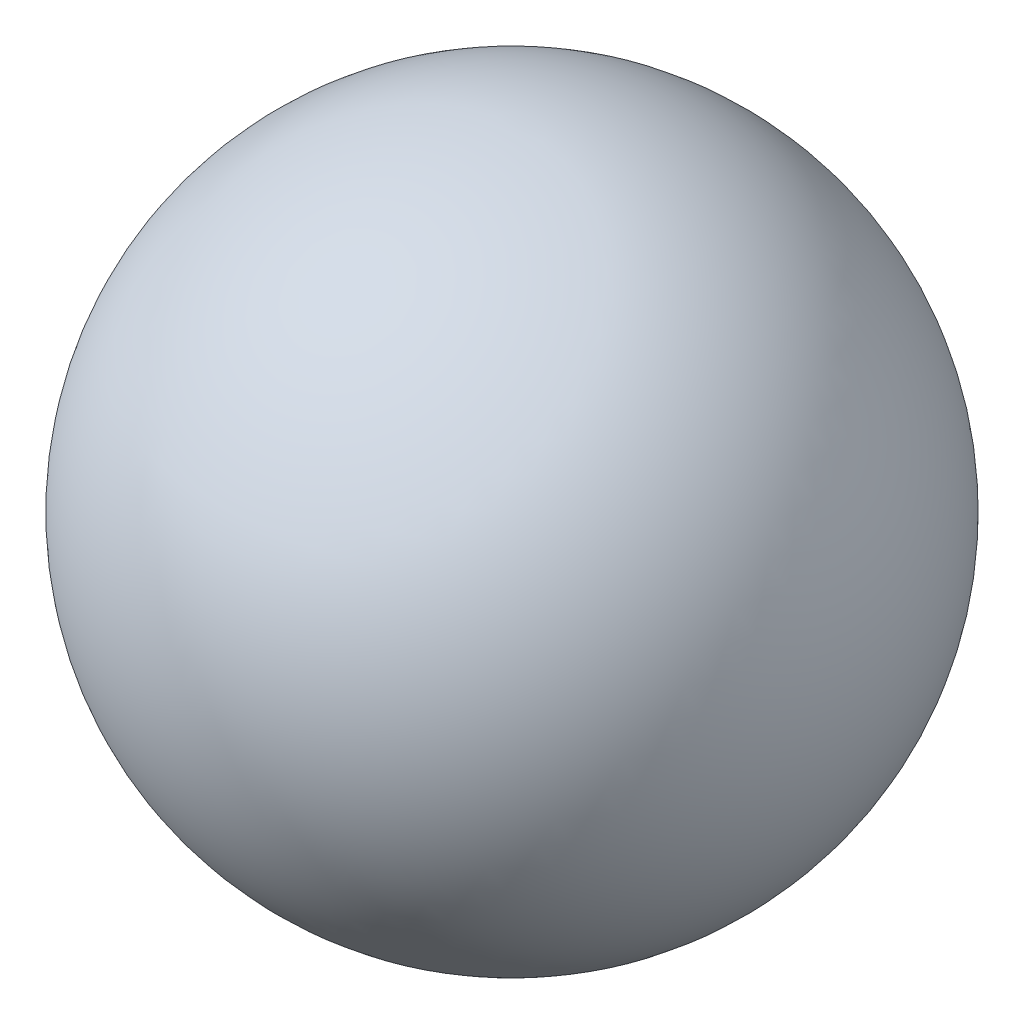
ISO-10303-21;
HEADER;
FILE_DESCRIPTION(('STEP AP214'),'2;1');
FILE_NAME('part.step','',(''),(''),'','','');
FILE_SCHEMA(('AUTOMOTIVE_DESIGN { 1 0 10303 214 1 1 1 1 }'));
ENDSEC;
DATA;
#1=APPLICATION_CONTEXT('core data for automotive mechanical design processes');
#2=APPLICATION_PROTOCOL_DEFINITION('international standard','automotive_design',2000,#1);
#3=PRODUCT_CONTEXT('',#1,'mechanical');
#4=PRODUCT('Part','Part','',(#3));
#5=PRODUCT_RELATED_PRODUCT_CATEGORY('part','',(#4));
#6=PRODUCT_DEFINITION_FORMATION('','',#4);
#7=PRODUCT_DEFINITION_CONTEXT('part definition',#1,'design');
#8=PRODUCT_DEFINITION('design','',#6,#7);
#9=PRODUCT_DEFINITION_SHAPE('','',#8);
#10=(LENGTH_UNIT() NAMED_UNIT(*) SI_UNIT(.MILLI.,.METRE.));
#11=(NAMED_UNIT(*) PLANE_ANGLE_UNIT() SI_UNIT($,.RADIAN.));
#12=(NAMED_UNIT(*) SI_UNIT($,.STERADIAN.) SOLID_ANGLE_UNIT());
#13=UNCERTAINTY_MEASURE_WITH_UNIT(LENGTH_MEASURE(1.E-05),#10,'distance_accuracy_value','');
#14=(GEOMETRIC_REPRESENTATION_CONTEXT(3) GLOBAL_UNCERTAINTY_ASSIGNED_CONTEXT((#13)) GLOBAL_UNIT_ASSIGNED_CONTEXT((#10,
#11,#12)) REPRESENTATION_CONTEXT('',''));
#15=CARTESIAN_POINT('',(0.,0.,0.));
#16=DIRECTION('',(0.,0.,1.));
#17=DIRECTION('',(1.,0.,0.));
#18=AXIS2_PLACEMENT_3D('',#15,#16,#17);
#19=CARTESIAN_POINT('',(0.,0.,0.));
#20=DIRECTION('',(0.,1.,0.));
#21=DIRECTION('',(0.,0.,1.));
#22=AXIS2_PLACEMENT_3D('',#19,#20,#21);
#23=SPHERICAL_SURFACE('',#22,100.1);
#24=CARTESIAN_POINT('',(0.,100.1,0.));
#25=VERTEX_POINT('',#24);
#26=VERTEX_LOOP('',#25);
#27=FACE_BOUND('',#26,.T.);
#28=ADVANCED_FACE('F37',(#27),#23,.T.);
#29=CLOSED_SHELL('',(#28));
#30=MANIFOLD_SOLID_BREP('B2',#29);
#31=ADVANCED_BREP_SHAPE_REPRESENTATION('',(#18,#30),#14);
#32=SHAPE_DEFINITION_REPRESENTATION(#9,#31);
ENDSEC;
END-ISO-10303-21;
